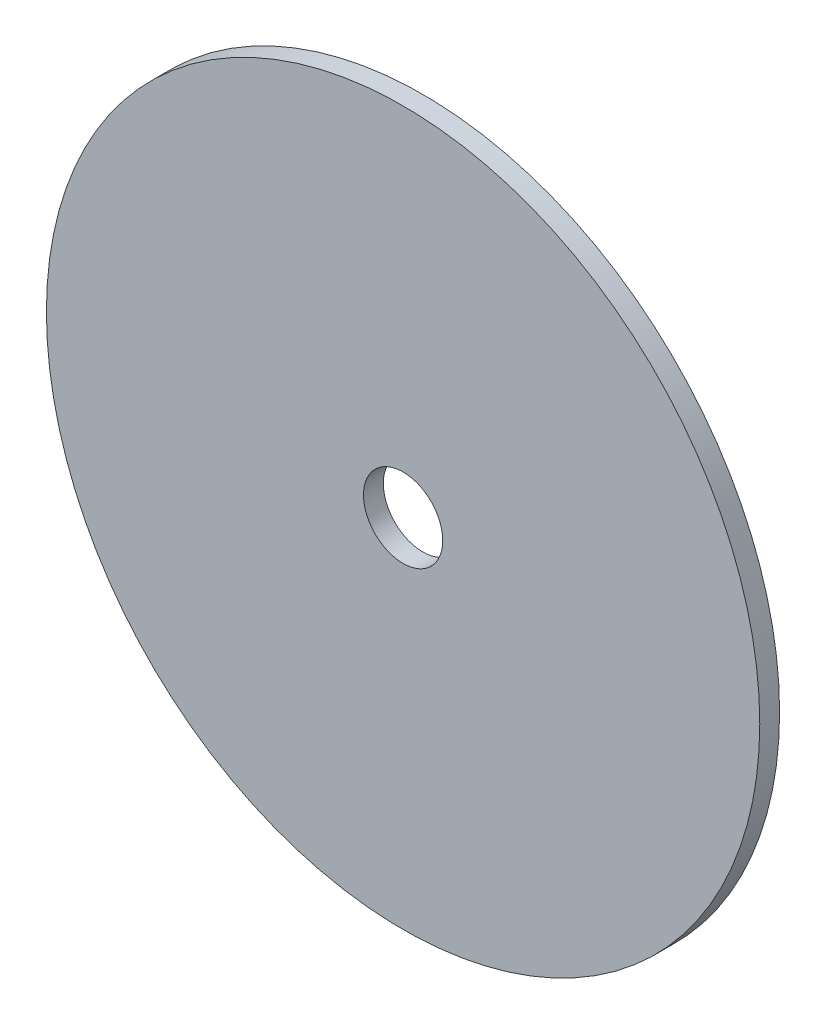
ISO-10303-21;
HEADER;
FILE_DESCRIPTION(('STEP AP214'),'2;1');
FILE_NAME('part.step','',(''),(''),'','','');
FILE_SCHEMA(('AUTOMOTIVE_DESIGN { 1 0 10303 214 1 1 1 1 }'));
ENDSEC;
DATA;
#1=APPLICATION_CONTEXT('core data for automotive mechanical design processes');
#2=APPLICATION_PROTOCOL_DEFINITION('international standard','automotive_design',2000,#1);
#3=PRODUCT_CONTEXT('',#1,'mechanical');
#4=PRODUCT('Part','Part','',(#3));
#5=PRODUCT_RELATED_PRODUCT_CATEGORY('part','',(#4));
#6=PRODUCT_DEFINITION_FORMATION('','',#4);
#7=PRODUCT_DEFINITION_CONTEXT('part definition',#1,'design');
#8=PRODUCT_DEFINITION('design','',#6,#7);
#9=PRODUCT_DEFINITION_SHAPE('','',#8);
#10=(LENGTH_UNIT() NAMED_UNIT(*) SI_UNIT(.MILLI.,.METRE.));
#11=(NAMED_UNIT(*) PLANE_ANGLE_UNIT() SI_UNIT($,.RADIAN.));
#12=(NAMED_UNIT(*) SI_UNIT($,.STERADIAN.) SOLID_ANGLE_UNIT());
#13=UNCERTAINTY_MEASURE_WITH_UNIT(LENGTH_MEASURE(1.E-05),#10,'distance_accuracy_value','');
#14=(GEOMETRIC_REPRESENTATION_CONTEXT(3) GLOBAL_UNCERTAINTY_ASSIGNED_CONTEXT((#13)) GLOBAL_UNIT_ASSIGNED_CONTEXT((#10,
#11,#12)) REPRESENTATION_CONTEXT('',''));
#15=CARTESIAN_POINT('',(0.,0.,0.));
#16=DIRECTION('',(0.,0.,1.));
#17=DIRECTION('',(1.,0.,0.));
#18=AXIS2_PLACEMENT_3D('',#15,#16,#17);
#19=CARTESIAN_POINT('',(0.,0.,6.35));
#20=DIRECTION('',(0.,0.,-1.));
#21=DIRECTION('',(-1.,0.,0.));
#22=AXIS2_PLACEMENT_3D('',#19,#20,#21);
#23=CYLINDRICAL_SURFACE('',#22,114.3);
#24=CARTESIAN_POINT('',(0.,0.,6.35));
#25=DIRECTION('',(0.,0.,1.));
#26=DIRECTION('',(1.,0.,0.));
#27=AXIS2_PLACEMENT_3D('',#24,#25,#26);
#28=CIRCLE('',#27,114.3);
#29=CARTESIAN_POINT('',(114.3,0.,6.35));
#30=VERTEX_POINT('',#29);
#31=EDGE_CURVE('E10',#30,#30,#28,.T.);
#32=ORIENTED_EDGE('',*,*,#31,.F.);
#33=EDGE_LOOP('',(#32));
#34=FACE_BOUND('',#33,.T.);
#35=CARTESIAN_POINT('',(0.,0.,0.));
#36=DIRECTION('',(0.,0.,1.));
#37=DIRECTION('',(1.,0.,0.));
#38=AXIS2_PLACEMENT_3D('',#35,#36,#37);
#39=CIRCLE('',#38,114.3);
#40=CARTESIAN_POINT('',(114.3,0.,0.));
#41=VERTEX_POINT('',#40);
#42=EDGE_CURVE('E40',#41,#41,#39,.T.);
#43=ORIENTED_EDGE('',*,*,#42,.T.);
#44=EDGE_LOOP('',(#43));
#45=FACE_BOUND('',#44,.T.);
#46=ADVANCED_FACE('F37',(#34,#45),#23,.T.);
#47=CARTESIAN_POINT('',(0.,0.,6.35));
#48=DIRECTION('',(0.,0.,1.));
#49=DIRECTION('',(1.,0.,0.));
#50=AXIS2_PLACEMENT_3D('',#47,#48,#49);
#51=PLANE('',#50);
#52=CARTESIAN_POINT('',(0.,0.,6.35));
#53=DIRECTION('',(0.,0.,1.));
#54=DIRECTION('',(1.,0.,0.));
#55=AXIS2_PLACEMENT_3D('',#52,#53,#54);
#56=CIRCLE('',#55,12.7);
#57=CARTESIAN_POINT('',(12.7,0.,6.35));
#58=VERTEX_POINT('',#57);
#59=EDGE_CURVE('E49',#58,#58,#56,.T.);
#60=ORIENTED_EDGE('',*,*,#59,.F.);
#61=EDGE_LOOP('',(#60));
#62=FACE_BOUND('',#61,.T.);
#63=ORIENTED_EDGE('',*,*,#31,.T.);
#64=EDGE_LOOP('',(#63));
#65=FACE_BOUND('',#64,.T.);
#66=ADVANCED_FACE('F64',(#62,#65),#51,.T.);
#67=CARTESIAN_POINT('',(0.,0.,0.));
#68=DIRECTION('',(0.,0.,1.));
#69=DIRECTION('',(1.,0.,0.));
#70=AXIS2_PLACEMENT_3D('',#67,#68,#69);
#71=PLANE('',#70);
#72=CARTESIAN_POINT('',(0.,0.,0.));
#73=DIRECTION('',(0.,0.,1.));
#74=DIRECTION('',(1.,0.,0.));
#75=AXIS2_PLACEMENT_3D('',#72,#73,#74);
#76=CIRCLE('',#75,12.7);
#77=CARTESIAN_POINT('',(12.7,0.,0.));
#78=VERTEX_POINT('',#77);
#79=EDGE_CURVE('E47',#78,#78,#76,.T.);
#80=ORIENTED_EDGE('',*,*,#79,.T.);
#81=EDGE_LOOP('',(#80));
#82=FACE_BOUND('',#81,.T.);
#83=ORIENTED_EDGE('',*,*,#42,.F.);
#84=EDGE_LOOP('',(#83));
#85=FACE_BOUND('',#84,.T.);
#86=ADVANCED_FACE('F55',(#82,#85),#71,.F.);
#87=CARTESIAN_POINT('',(0.,0.,0.));
#88=DIRECTION('',(0.,0.,1.));
#89=DIRECTION('',(1.,0.,0.));
#90=AXIS2_PLACEMENT_3D('',#87,#88,#89);
#91=CYLINDRICAL_SURFACE('',#90,12.7);
#92=ORIENTED_EDGE('',*,*,#79,.F.);
#93=EDGE_LOOP('',(#92));
#94=FACE_BOUND('',#93,.T.);
#95=ORIENTED_EDGE('',*,*,#59,.T.);
#96=EDGE_LOOP('',(#95));
#97=FACE_BOUND('',#96,.T.);
#98=ADVANCED_FACE('F58',(#94,#97),#91,.F.);
#99=CLOSED_SHELL('',(#46,#66,#86,#98));
#100=MANIFOLD_SOLID_BREP('B2',#99);
#101=ADVANCED_BREP_SHAPE_REPRESENTATION('',(#18,#100),#14);
#102=SHAPE_DEFINITION_REPRESENTATION(#9,#101);
ENDSEC;
END-ISO-10303-21;
